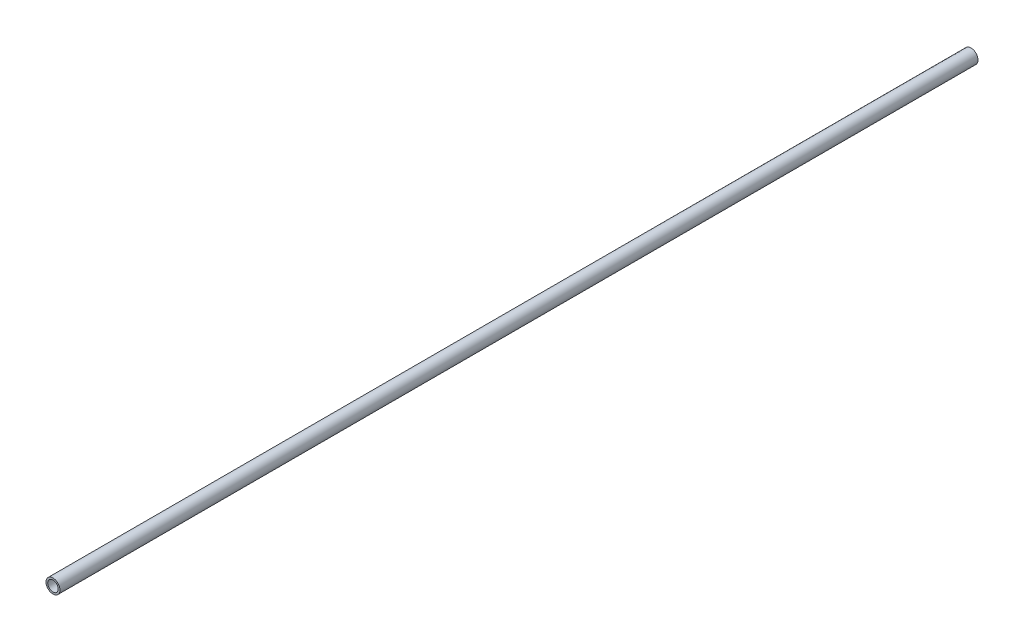
ISO-10303-21;
HEADER;
FILE_DESCRIPTION(('STEP AP214'),'2;1');
FILE_NAME('part.step','',(''),(''),'','','');
FILE_SCHEMA(('AUTOMOTIVE_DESIGN { 1 0 10303 214 1 1 1 1 }'));
ENDSEC;
DATA;
#1=APPLICATION_CONTEXT('core data for automotive mechanical design processes');
#2=APPLICATION_PROTOCOL_DEFINITION('international standard','automotive_design',2000,#1);
#3=PRODUCT_CONTEXT('',#1,'mechanical');
#4=PRODUCT('Part','Part','',(#3));
#5=PRODUCT_RELATED_PRODUCT_CATEGORY('part','',(#4));
#6=PRODUCT_DEFINITION_FORMATION('','',#4);
#7=PRODUCT_DEFINITION_CONTEXT('part definition',#1,'design');
#8=PRODUCT_DEFINITION('design','',#6,#7);
#9=PRODUCT_DEFINITION_SHAPE('','',#8);
#10=(LENGTH_UNIT() NAMED_UNIT(*) SI_UNIT(.MILLI.,.METRE.));
#11=(NAMED_UNIT(*) PLANE_ANGLE_UNIT() SI_UNIT($,.RADIAN.));
#12=(NAMED_UNIT(*) SI_UNIT($,.STERADIAN.) SOLID_ANGLE_UNIT());
#13=UNCERTAINTY_MEASURE_WITH_UNIT(LENGTH_MEASURE(1.E-05),#10,'distance_accuracy_value','');
#14=(GEOMETRIC_REPRESENTATION_CONTEXT(3) GLOBAL_UNCERTAINTY_ASSIGNED_CONTEXT((#13)) GLOBAL_UNIT_ASSIGNED_CONTEXT((#10,
#11,#12)) REPRESENTATION_CONTEXT('',''));
#15=CARTESIAN_POINT('',(0.,0.,0.));
#16=DIRECTION('',(0.,0.,1.));
#17=DIRECTION('',(1.,0.,0.));
#18=AXIS2_PLACEMENT_3D('',#15,#16,#17);
#19=CARTESIAN_POINT('',(0.,0.,208.8));
#20=DIRECTION('',(0.,0.,1.));
#21=DIRECTION('',(1.,0.,0.));
#22=AXIS2_PLACEMENT_3D('',#19,#20,#21);
#23=PLANE('',#22);
#24=CARTESIAN_POINT('',(0.,0.,208.8));
#25=DIRECTION('',(0.,0.,1.));
#26=DIRECTION('',(1.,0.,0.));
#27=AXIS2_PLACEMENT_3D('',#24,#25,#26);
#28=CIRCLE('',#27,3.175);
#29=CARTESIAN_POINT('',(3.175,0.,208.8));
#30=VERTEX_POINT('',#29);
#31=EDGE_CURVE('E10',#30,#30,#28,.T.);
#32=ORIENTED_EDGE('',*,*,#31,.T.);
#33=EDGE_LOOP('',(#32));
#34=FACE_BOUND('',#33,.T.);
#35=CARTESIAN_POINT('',(0.,0.,208.8));
#36=DIRECTION('',(0.,0.,1.));
#37=DIRECTION('',(1.,0.,0.));
#38=AXIS2_PLACEMENT_3D('',#35,#36,#37);
#39=CIRCLE('',#38,2.38125);
#40=CARTESIAN_POINT('',(2.38125,0.,208.8));
#41=VERTEX_POINT('',#40);
#42=EDGE_CURVE('E44',#41,#41,#39,.T.);
#43=ORIENTED_EDGE('',*,*,#42,.F.);
#44=EDGE_LOOP('',(#43));
#45=FACE_BOUND('',#44,.T.);
#46=ADVANCED_FACE('F33',(#34,#45),#23,.T.);
#47=CARTESIAN_POINT('',(0.,0.,-208.8));
#48=DIRECTION('',(0.,0.,1.));
#49=DIRECTION('',(1.,0.,0.));
#50=AXIS2_PLACEMENT_3D('',#47,#48,#49);
#51=PLANE('',#50);
#52=CARTESIAN_POINT('',(0.,0.,-208.8));
#53=DIRECTION('',(0.,0.,1.));
#54=DIRECTION('',(1.,0.,0.));
#55=AXIS2_PLACEMENT_3D('',#52,#53,#54);
#56=CIRCLE('',#55,3.175);
#57=CARTESIAN_POINT('',(3.175,0.,-208.8));
#58=VERTEX_POINT('',#57);
#59=EDGE_CURVE('E37',#58,#58,#56,.T.);
#60=ORIENTED_EDGE('',*,*,#59,.F.);
#61=EDGE_LOOP('',(#60));
#62=FACE_BOUND('',#61,.T.);
#63=CARTESIAN_POINT('',(0.,0.,-208.8));
#64=DIRECTION('',(0.,0.,1.));
#65=DIRECTION('',(1.,0.,0.));
#66=AXIS2_PLACEMENT_3D('',#63,#64,#65);
#67=CIRCLE('',#66,2.38125);
#68=CARTESIAN_POINT('',(2.38125,0.,-208.8));
#69=VERTEX_POINT('',#68);
#70=EDGE_CURVE('E46',#69,#69,#67,.T.);
#71=ORIENTED_EDGE('',*,*,#70,.T.);
#72=EDGE_LOOP('',(#71));
#73=FACE_BOUND('',#72,.T.);
#74=ADVANCED_FACE('F56',(#62,#73),#51,.F.);
#75=CARTESIAN_POINT('',(0.,0.,208.8));
#76=DIRECTION('',(0.,0.,-1.));
#77=DIRECTION('',(-1.,0.,0.));
#78=AXIS2_PLACEMENT_3D('',#75,#76,#77);
#79=CYLINDRICAL_SURFACE('',#78,3.175);
#80=ORIENTED_EDGE('',*,*,#31,.F.);
#81=EDGE_LOOP('',(#80));
#82=FACE_BOUND('',#81,.T.);
#83=ORIENTED_EDGE('',*,*,#59,.T.);
#84=EDGE_LOOP('',(#83));
#85=FACE_BOUND('',#84,.T.);
#86=ADVANCED_FACE('F35',(#82,#85),#79,.T.);
#87=CARTESIAN_POINT('',(0.,0.,208.8));
#88=DIRECTION('',(0.,0.,-1.));
#89=DIRECTION('',(-1.,0.,0.));
#90=AXIS2_PLACEMENT_3D('',#87,#88,#89);
#91=CYLINDRICAL_SURFACE('',#90,2.38125);
#92=ORIENTED_EDGE('',*,*,#42,.T.);
#93=EDGE_LOOP('',(#92));
#94=FACE_BOUND('',#93,.T.);
#95=ORIENTED_EDGE('',*,*,#70,.F.);
#96=EDGE_LOOP('',(#95));
#97=FACE_BOUND('',#96,.T.);
#98=ADVANCED_FACE('F52',(#94,#97),#91,.F.);
#99=CLOSED_SHELL('',(#46,#74,#86,#98));
#100=MANIFOLD_SOLID_BREP('B2',#99);
#101=ADVANCED_BREP_SHAPE_REPRESENTATION('',(#18,#100),#14);
#102=SHAPE_DEFINITION_REPRESENTATION(#9,#101);
ENDSEC;
END-ISO-10303-21;
